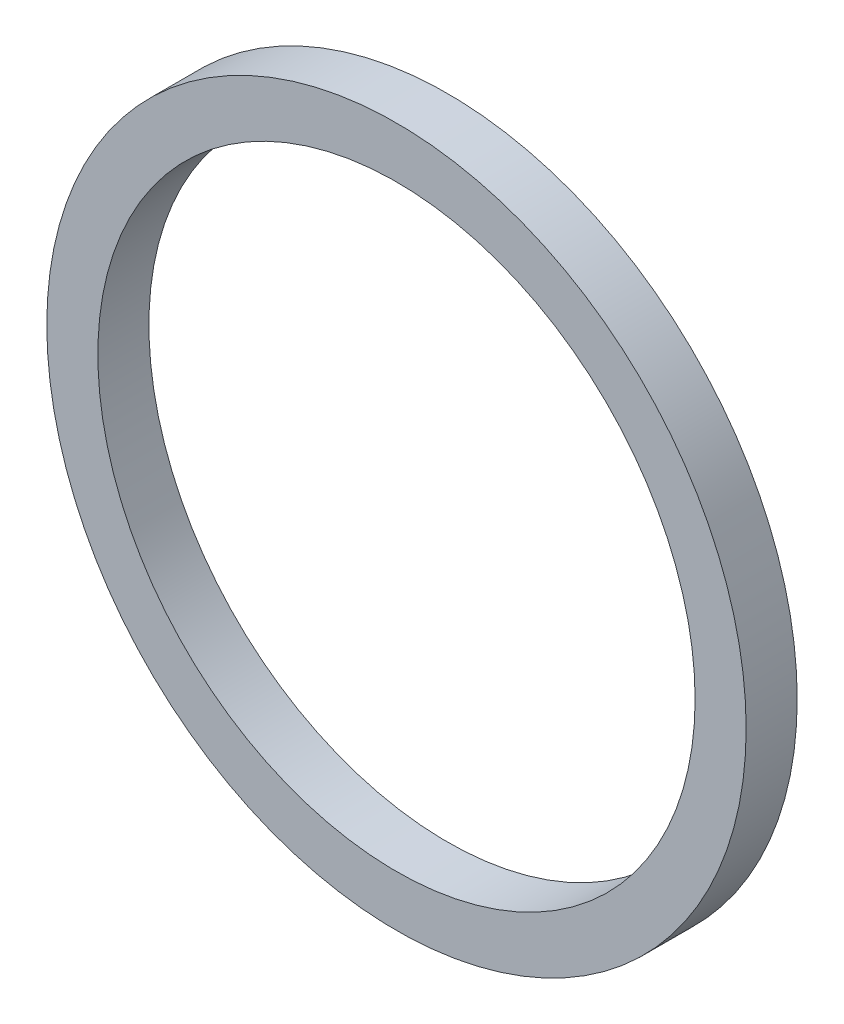
ISO-10303-21;
HEADER;
FILE_DESCRIPTION(('STEP AP214'),'2;1');
FILE_NAME('part.step','',(''),(''),'','','');
FILE_SCHEMA(('AUTOMOTIVE_DESIGN { 1 0 10303 214 1 1 1 1 }'));
ENDSEC;
DATA;
#1=APPLICATION_CONTEXT('core data for automotive mechanical design processes');
#2=APPLICATION_PROTOCOL_DEFINITION('international standard','automotive_design',2000,#1);
#3=PRODUCT_CONTEXT('',#1,'mechanical');
#4=PRODUCT('Part','Part','',(#3));
#5=PRODUCT_RELATED_PRODUCT_CATEGORY('part','',(#4));
#6=PRODUCT_DEFINITION_FORMATION('','',#4);
#7=PRODUCT_DEFINITION_CONTEXT('part definition',#1,'design');
#8=PRODUCT_DEFINITION('design','',#6,#7);
#9=PRODUCT_DEFINITION_SHAPE('','',#8);
#10=(LENGTH_UNIT() NAMED_UNIT(*) SI_UNIT(.MILLI.,.METRE.));
#11=(NAMED_UNIT(*) PLANE_ANGLE_UNIT() SI_UNIT($,.RADIAN.));
#12=(NAMED_UNIT(*) SI_UNIT($,.STERADIAN.) SOLID_ANGLE_UNIT());
#13=UNCERTAINTY_MEASURE_WITH_UNIT(LENGTH_MEASURE(1.E-05),#10,'distance_accuracy_value','');
#14=(GEOMETRIC_REPRESENTATION_CONTEXT(3) GLOBAL_UNCERTAINTY_ASSIGNED_CONTEXT((#13)) GLOBAL_UNIT_ASSIGNED_CONTEXT((#10,
#11,#12)) REPRESENTATION_CONTEXT('',''));
#15=CARTESIAN_POINT('',(0.,0.,0.));
#16=DIRECTION('',(0.,0.,1.));
#17=DIRECTION('',(1.,0.,0.));
#18=AXIS2_PLACEMENT_3D('',#15,#16,#17);
#19=CARTESIAN_POINT('',(0.,0.,2.));
#20=DIRECTION('',(0.,0.,1.));
#21=DIRECTION('',(1.,0.,0.));
#22=AXIS2_PLACEMENT_3D('',#19,#20,#21);
#23=PLANE('',#22);
#24=CARTESIAN_POINT('',(0.,0.,2.));
#25=DIRECTION('',(0.,0.,1.));
#26=DIRECTION('',(1.,0.,0.));
#27=AXIS2_PLACEMENT_3D('',#24,#25,#26);
#28=CIRCLE('',#27,13.7);
#29=CARTESIAN_POINT('',(13.7,0.,2.));
#30=VERTEX_POINT('',#29);
#31=EDGE_CURVE('E10',#30,#30,#28,.T.);
#32=ORIENTED_EDGE('',*,*,#31,.T.);
#33=EDGE_LOOP('',(#32));
#34=FACE_BOUND('',#33,.T.);
#35=CARTESIAN_POINT('',(0.,0.,2.));
#36=DIRECTION('',(0.,0.,1.));
#37=DIRECTION('',(1.,0.,0.));
#38=AXIS2_PLACEMENT_3D('',#35,#36,#37);
#39=CIRCLE('',#38,11.7);
#40=CARTESIAN_POINT('',(11.7,0.,2.));
#41=VERTEX_POINT('',#40);
#42=EDGE_CURVE('E42',#41,#41,#39,.T.);
#43=ORIENTED_EDGE('',*,*,#42,.F.);
#44=EDGE_LOOP('',(#43));
#45=FACE_BOUND('',#44,.T.);
#46=ADVANCED_FACE('F31',(#34,#45),#23,.T.);
#47=CARTESIAN_POINT('',(0.,0.,0.));
#48=DIRECTION('',(0.,0.,1.));
#49=DIRECTION('',(1.,0.,0.));
#50=AXIS2_PLACEMENT_3D('',#47,#48,#49);
#51=PLANE('',#50);
#52=CARTESIAN_POINT('',(0.,0.,0.));
#53=DIRECTION('',(0.,0.,1.));
#54=DIRECTION('',(1.,0.,0.));
#55=AXIS2_PLACEMENT_3D('',#52,#53,#54);
#56=CIRCLE('',#55,13.7);
#57=CARTESIAN_POINT('',(13.7,0.,0.));
#58=VERTEX_POINT('',#57);
#59=EDGE_CURVE('E38',#58,#58,#56,.T.);
#60=ORIENTED_EDGE('',*,*,#59,.F.);
#61=EDGE_LOOP('',(#60));
#62=FACE_BOUND('',#61,.T.);
#63=CARTESIAN_POINT('',(0.,0.,0.));
#64=DIRECTION('',(0.,0.,1.));
#65=DIRECTION('',(1.,0.,0.));
#66=AXIS2_PLACEMENT_3D('',#63,#64,#65);
#67=CIRCLE('',#66,11.7);
#68=CARTESIAN_POINT('',(11.7,0.,0.));
#69=VERTEX_POINT('',#68);
#70=EDGE_CURVE('E46',#69,#69,#67,.T.);
#71=ORIENTED_EDGE('',*,*,#70,.T.);
#72=EDGE_LOOP('',(#71));
#73=FACE_BOUND('',#72,.T.);
#74=ADVANCED_FACE('F52',(#62,#73),#51,.F.);
#75=CARTESIAN_POINT('',(0.,0.,2.));
#76=DIRECTION('',(0.,0.,-1.));
#77=DIRECTION('',(-1.,0.,0.));
#78=AXIS2_PLACEMENT_3D('',#75,#76,#77);
#79=CYLINDRICAL_SURFACE('',#78,13.7);
#80=ORIENTED_EDGE('',*,*,#31,.F.);
#81=EDGE_LOOP('',(#80));
#82=FACE_BOUND('',#81,.T.);
#83=ORIENTED_EDGE('',*,*,#59,.T.);
#84=EDGE_LOOP('',(#83));
#85=FACE_BOUND('',#84,.T.);
#86=ADVANCED_FACE('F33',(#82,#85),#79,.T.);
#87=CARTESIAN_POINT('',(0.,0.,2.));
#88=DIRECTION('',(0.,0.,-1.));
#89=DIRECTION('',(-1.,0.,0.));
#90=AXIS2_PLACEMENT_3D('',#87,#88,#89);
#91=CYLINDRICAL_SURFACE('',#90,11.7);
#92=ORIENTED_EDGE('',*,*,#42,.T.);
#93=EDGE_LOOP('',(#92));
#94=FACE_BOUND('',#93,.T.);
#95=ORIENTED_EDGE('',*,*,#70,.F.);
#96=EDGE_LOOP('',(#95));
#97=FACE_BOUND('',#96,.T.);
#98=ADVANCED_FACE('F54',(#94,#97),#91,.F.);
#99=CLOSED_SHELL('',(#46,#74,#86,#98));
#100=MANIFOLD_SOLID_BREP('B2',#99);
#101=ADVANCED_BREP_SHAPE_REPRESENTATION('',(#18,#100),#14);
#102=SHAPE_DEFINITION_REPRESENTATION(#9,#101);
ENDSEC;
END-ISO-10303-21;
